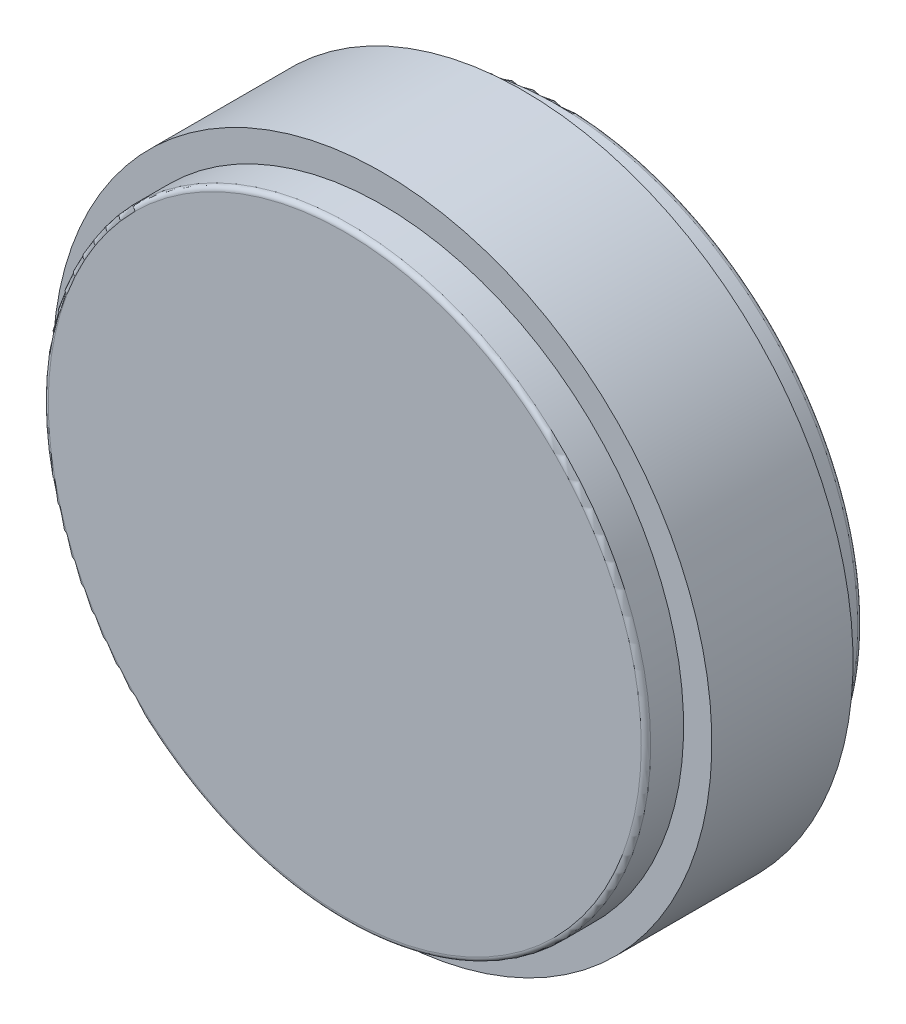
ISO-10303-21;
HEADER;
FILE_DESCRIPTION(('STEP AP214'),'2;1');
FILE_NAME('part.step','',(''),(''),'','','');
FILE_SCHEMA(('AUTOMOTIVE_DESIGN { 1 0 10303 214 1 1 1 1 }'));
ENDSEC;
DATA;
#1=APPLICATION_CONTEXT('core data for automotive mechanical design processes');
#2=APPLICATION_PROTOCOL_DEFINITION('international standard','automotive_design',2000,#1);
#3=PRODUCT_CONTEXT('',#1,'mechanical');
#4=PRODUCT('Part','Part','',(#3));
#5=PRODUCT_RELATED_PRODUCT_CATEGORY('part','',(#4));
#6=PRODUCT_DEFINITION_FORMATION('','',#4);
#7=PRODUCT_DEFINITION_CONTEXT('part definition',#1,'design');
#8=PRODUCT_DEFINITION('design','',#6,#7);
#9=PRODUCT_DEFINITION_SHAPE('','',#8);
#10=(LENGTH_UNIT() NAMED_UNIT(*) SI_UNIT(.MILLI.,.METRE.));
#11=(NAMED_UNIT(*) PLANE_ANGLE_UNIT() SI_UNIT($,.RADIAN.));
#12=(NAMED_UNIT(*) SI_UNIT($,.STERADIAN.) SOLID_ANGLE_UNIT());
#13=UNCERTAINTY_MEASURE_WITH_UNIT(LENGTH_MEASURE(1.E-05),#10,'distance_accuracy_value','');
#14=(GEOMETRIC_REPRESENTATION_CONTEXT(3) GLOBAL_UNCERTAINTY_ASSIGNED_CONTEXT((#13)) GLOBAL_UNIT_ASSIGNED_CONTEXT((#10,
#11,#12)) REPRESENTATION_CONTEXT('',''));
#15=CARTESIAN_POINT('',(0.,0.,0.));
#16=DIRECTION('',(0.,0.,1.));
#17=DIRECTION('',(1.,0.,0.));
#18=AXIS2_PLACEMENT_3D('',#15,#16,#17);
#19=CARTESIAN_POINT('',(0.,0.,0.));
#20=DIRECTION('',(0.,0.,1.));
#21=DIRECTION('',(1.,0.,0.));
#22=AXIS2_PLACEMENT_3D('',#19,#20,#21);
#23=PLANE('',#22);
#24=CARTESIAN_POINT('',(0.,0.,0.));
#25=DIRECTION('',(0.,0.,1.));
#26=DIRECTION('',(1.,0.,0.));
#27=AXIS2_PLACEMENT_3D('',#24,#25,#26);
#28=CIRCLE('',#27,31.5);
#29=CARTESIAN_POINT('',(31.5,0.,0.));
#30=VERTEX_POINT('',#29);
#31=EDGE_CURVE('E80',#30,#30,#28,.T.);
#32=ORIENTED_EDGE('',*,*,#31,.T.);
#33=EDGE_LOOP('',(#32));
#34=FACE_BOUND('',#33,.T.);
#35=ADVANCED_FACE('F38',(#34),#23,.T.);
#36=CARTESIAN_POINT('',(0.,0.,-23.));
#37=DIRECTION('',(0.,0.,-1.));
#38=DIRECTION('',(-1.,0.,0.));
#39=AXIS2_PLACEMENT_3D('',#36,#37,#38);
#40=CYLINDRICAL_SURFACE('',#39,32.);
#41=CARTESIAN_POINT('',(0.,0.,-0.499999999999997));
#42=DIRECTION('',(0.,0.,1.));
#43=DIRECTION('',(1.,0.,0.));
#44=AXIS2_PLACEMENT_3D('',#41,#42,#43);
#45=CIRCLE('',#44,32.);
#46=CARTESIAN_POINT('',(32.,0.,-0.499999999999997));
#47=VERTEX_POINT('',#46);
#48=EDGE_CURVE('E77',#47,#47,#45,.F.);
#49=ORIENTED_EDGE('',*,*,#48,.T.);
#50=EDGE_LOOP('',(#49));
#51=FACE_BOUND('',#50,.T.);
#52=CARTESIAN_POINT('',(0.,0.,-4.));
#53=DIRECTION('',(0.,0.,-1.));
#54=DIRECTION('',(-1.,0.,0.));
#55=AXIS2_PLACEMENT_3D('',#52,#53,#54);
#56=CIRCLE('',#55,32.);
#57=CARTESIAN_POINT('',(-32.,0.,-4.));
#58=VERTEX_POINT('',#57);
#59=EDGE_CURVE('E74',#58,#58,#56,.T.);
#60=ORIENTED_EDGE('',*,*,#59,.F.);
#61=EDGE_LOOP('',(#60));
#62=FACE_BOUND('',#61,.T.);
#63=ADVANCED_FACE('F100',(#51,#62),#40,.T.);
#64=CARTESIAN_POINT('',(-32.,0.,-4.));
#65=DIRECTION('',(0.,0.,1.));
#66=DIRECTION('',(1.,0.,0.));
#67=AXIS2_PLACEMENT_3D('',#64,#65,#66);
#68=PLANE('',#67);
#69=ORIENTED_EDGE('',*,*,#59,.T.);
#70=EDGE_LOOP('',(#69));
#71=FACE_BOUND('',#70,.T.);
#72=CARTESIAN_POINT('',(0.,0.,-4.));
#73=DIRECTION('',(0.,0.,-1.));
#74=DIRECTION('',(-1.,0.,0.));
#75=AXIS2_PLACEMENT_3D('',#72,#73,#74);
#76=CIRCLE('',#75,35.);
#77=CARTESIAN_POINT('',(-35.,0.,-4.));
#78=VERTEX_POINT('',#77);
#79=EDGE_CURVE('E71',#78,#78,#76,.T.);
#80=ORIENTED_EDGE('',*,*,#79,.F.);
#81=EDGE_LOOP('',(#80));
#82=FACE_BOUND('',#81,.T.);
#83=ADVANCED_FACE('F106',(#71,#82),#68,.T.);
#84=CARTESIAN_POINT('',(0.,0.,-23.));
#85=DIRECTION('',(0.,0.,-1.));
#86=DIRECTION('',(-1.,0.,0.));
#87=AXIS2_PLACEMENT_3D('',#84,#85,#86);
#88=CYLINDRICAL_SURFACE('',#87,35.);
#89=ORIENTED_EDGE('',*,*,#79,.T.);
#90=EDGE_LOOP('',(#89));
#91=FACE_BOUND('',#90,.T.);
#92=CARTESIAN_POINT('',(0.,0.,-19.));
#93=DIRECTION('',(0.,0.,-1.));
#94=DIRECTION('',(-1.,0.,0.));
#95=AXIS2_PLACEMENT_3D('',#92,#93,#94);
#96=CIRCLE('',#95,35.);
#97=CARTESIAN_POINT('',(-35.,0.,-19.));
#98=VERTEX_POINT('',#97);
#99=EDGE_CURVE('E68',#98,#98,#96,.T.);
#100=ORIENTED_EDGE('',*,*,#99,.F.);
#101=EDGE_LOOP('',(#100));
#102=FACE_BOUND('',#101,.T.);
#103=ADVANCED_FACE('F112',(#91,#102),#88,.T.);
#104=CARTESIAN_POINT('',(-35.,0.,-19.));
#105=DIRECTION('',(0.,0.,-1.));
#106=DIRECTION('',(-1.,0.,0.));
#107=AXIS2_PLACEMENT_3D('',#104,#105,#106);
#108=PLANE('',#107);
#109=ORIENTED_EDGE('',*,*,#99,.T.);
#110=EDGE_LOOP('',(#109));
#111=FACE_BOUND('',#110,.T.);
#112=CARTESIAN_POINT('',(0.,0.,-19.));
#113=DIRECTION('',(0.,0.,-1.));
#114=DIRECTION('',(-1.,0.,0.));
#115=AXIS2_PLACEMENT_3D('',#112,#113,#114);
#116=CIRCLE('',#115,32.);
#117=CARTESIAN_POINT('',(-32.,0.,-19.));
#118=VERTEX_POINT('',#117);
#119=EDGE_CURVE('E64',#118,#118,#116,.T.);
#120=ORIENTED_EDGE('',*,*,#119,.F.);
#121=EDGE_LOOP('',(#120));
#122=FACE_BOUND('',#121,.T.);
#123=ADVANCED_FACE('F116',(#111,#122),#108,.T.);
#124=CARTESIAN_POINT('',(0.,0.,-23.));
#125=DIRECTION('',(0.,0.,-1.));
#126=DIRECTION('',(-1.,0.,0.));
#127=AXIS2_PLACEMENT_3D('',#124,#125,#126);
#128=CYLINDRICAL_SURFACE('',#127,32.);
#129=CARTESIAN_POINT('',(0.,0.,-22.5));
#130=DIRECTION('',(0.,0.,-1.));
#131=DIRECTION('',(-1.,0.,0.));
#132=AXIS2_PLACEMENT_3D('',#129,#130,#131);
#133=CIRCLE('',#132,32.);
#134=CARTESIAN_POINT('',(-32.,0.,-22.5));
#135=VERTEX_POINT('',#134);
#136=EDGE_CURVE('E11',#135,#135,#133,.F.);
#137=ORIENTED_EDGE('',*,*,#136,.T.);
#138=EDGE_LOOP('',(#137));
#139=FACE_BOUND('',#138,.T.);
#140=ORIENTED_EDGE('',*,*,#119,.T.);
#141=EDGE_LOOP('',(#140));
#142=FACE_BOUND('',#141,.T.);
#143=ADVANCED_FACE('F120',(#139,#142),#128,.T.);
#144=CARTESIAN_POINT('',(-32.,0.,-23.));
#145=DIRECTION('',(0.,0.,-1.));
#146=DIRECTION('',(-1.,0.,0.));
#147=AXIS2_PLACEMENT_3D('',#144,#145,#146);
#148=PLANE('',#147);
#149=CARTESIAN_POINT('',(0.,0.,-23.));
#150=DIRECTION('',(0.,0.,-1.));
#151=DIRECTION('',(-1.,0.,0.));
#152=AXIS2_PLACEMENT_3D('',#149,#150,#151);
#153=CIRCLE('',#152,12.5);
#154=CARTESIAN_POINT('',(-12.5,0.,-23.));
#155=VERTEX_POINT('',#154);
#156=EDGE_CURVE('E57',#155,#155,#153,.T.);
#157=ORIENTED_EDGE('',*,*,#156,.F.);
#158=EDGE_LOOP('',(#157));
#159=FACE_BOUND('',#158,.T.);
#160=CARTESIAN_POINT('',(0.,0.,-23.));
#161=DIRECTION('',(0.,0.,-1.));
#162=DIRECTION('',(-1.,0.,0.));
#163=AXIS2_PLACEMENT_3D('',#160,#161,#162);
#164=CIRCLE('',#163,31.5);
#165=CARTESIAN_POINT('',(-31.5,0.,-23.));
#166=VERTEX_POINT('',#165);
#167=EDGE_CURVE('E45',#166,#166,#164,.T.);
#168=ORIENTED_EDGE('',*,*,#167,.T.);
#169=EDGE_LOOP('',(#168));
#170=FACE_BOUND('',#169,.T.);
#171=ADVANCED_FACE('F85',(#159,#170),#148,.T.);
#172=CARTESIAN_POINT('',(0.,0.,-0.499999999999997));
#173=DIRECTION('',(0.,0.,1.));
#174=DIRECTION('',(1.,0.,0.));
#175=AXIS2_PLACEMENT_3D('',#172,#173,#174);
#176=TOROIDAL_SURFACE('',#175,31.5,0.5);
#177=ORIENTED_EDGE('',*,*,#31,.F.);
#178=EDGE_LOOP('',(#177));
#179=FACE_BOUND('',#178,.T.);
#180=ORIENTED_EDGE('',*,*,#48,.F.);
#181=EDGE_LOOP('',(#180));
#182=FACE_BOUND('',#181,.T.);
#183=ADVANCED_FACE('F89',(#179,#182),#176,.T.);
#184=CARTESIAN_POINT('',(0.,0.,-22.5));
#185=DIRECTION('',(0.,0.,-1.));
#186=DIRECTION('',(-1.,0.,0.));
#187=AXIS2_PLACEMENT_3D('',#184,#185,#186);
#188=TOROIDAL_SURFACE('',#187,31.5,0.5);
#189=ORIENTED_EDGE('',*,*,#136,.F.);
#190=EDGE_LOOP('',(#189));
#191=FACE_BOUND('',#190,.T.);
#192=ORIENTED_EDGE('',*,*,#167,.F.);
#193=EDGE_LOOP('',(#192));
#194=FACE_BOUND('',#193,.T.);
#195=ADVANCED_FACE('F40',(#191,#194),#188,.T.);
#196=CARTESIAN_POINT('',(0.,0.,-22.5));
#197=DIRECTION('',(0.,0.,-1.));
#198=DIRECTION('',(-1.,0.,0.));
#199=AXIS2_PLACEMENT_3D('',#196,#197,#198);
#200=CYLINDRICAL_SURFACE('',#199,12.5);
#201=CARTESIAN_POINT('',(0.,0.,-22.5));
#202=DIRECTION('',(0.,0.,-1.));
#203=DIRECTION('',(-1.,0.,0.));
#204=AXIS2_PLACEMENT_3D('',#201,#202,#203);
#205=CIRCLE('',#204,12.5);
#206=CARTESIAN_POINT('',(-12.5,0.,-22.5));
#207=VERTEX_POINT('',#206);
#208=EDGE_CURVE('E60',#207,#207,#205,.T.);
#209=ORIENTED_EDGE('',*,*,#208,.F.);
#210=EDGE_LOOP('',(#209));
#211=FACE_BOUND('',#210,.T.);
#212=ORIENTED_EDGE('',*,*,#156,.T.);
#213=EDGE_LOOP('',(#212));
#214=FACE_BOUND('',#213,.T.);
#215=ADVANCED_FACE('F88',(#211,#214),#200,.F.);
#216=CARTESIAN_POINT('',(0.,0.,-22.5));
#217=DIRECTION('',(0.,0.,-1.));
#218=DIRECTION('',(-1.,0.,0.));
#219=AXIS2_PLACEMENT_3D('',#216,#217,#218);
#220=PLANE('',#219);
#221=CARTESIAN_POINT('',(0.,0.,-22.5));
#222=DIRECTION('',(0.,0.,-1.));
#223=DIRECTION('',(0.,1.,0.));
#224=AXIS2_PLACEMENT_3D('',#221,#222,#223);
#225=CIRCLE('',#224,3.);
#226=CARTESIAN_POINT('',(0.,3.,-22.5));
#227=VERTEX_POINT('',#226);
#228=EDGE_CURVE('E55',#227,#227,#225,.T.);
#229=ORIENTED_EDGE('',*,*,#228,.F.);
#230=EDGE_LOOP('',(#229));
#231=FACE_BOUND('',#230,.T.);
#232=ORIENTED_EDGE('',*,*,#208,.T.);
#233=EDGE_LOOP('',(#232));
#234=FACE_BOUND('',#233,.T.);
#235=ADVANCED_FACE('F51',(#231,#234),#220,.T.);
#236=CARTESIAN_POINT('',(0.,0.,-22.5));
#237=DIRECTION('',(0.,0.,-1.));
#238=DIRECTION('',(0.,1.,0.));
#239=AXIS2_PLACEMENT_3D('',#236,#237,#238);
#240=CONICAL_SURFACE('',#239,3.,0.785398163397443);
#241=CARTESIAN_POINT('',(0.,0.,-19.5));
#242=VERTEX_POINT('',#241);
#243=VERTEX_LOOP('',#242);
#244=FACE_BOUND('',#243,.T.);
#245=ORIENTED_EDGE('',*,*,#228,.T.);
#246=EDGE_LOOP('',(#245));
#247=FACE_BOUND('',#246,.T.);
#248=ADVANCED_FACE('F48',(#244,#247),#240,.F.);
#249=CLOSED_SHELL('',(#35,#63,#83,#103,#123,#143,#171,#183,#195,#215,#235,#248));
#250=MANIFOLD_SOLID_BREP('B2',#249);
#251=ADVANCED_BREP_SHAPE_REPRESENTATION('',(#18,#250),#14);
#252=SHAPE_DEFINITION_REPRESENTATION(#9,#251);
ENDSEC;
END-ISO-10303-21;
